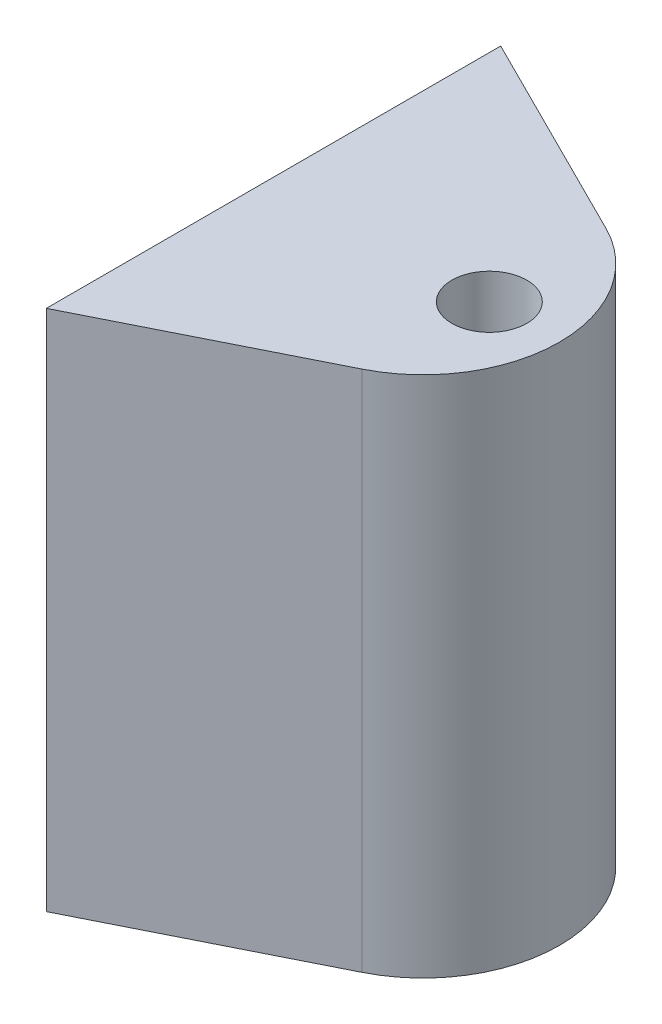
ISO-10303-21;
HEADER;
FILE_DESCRIPTION(('STEP AP214'),'2;1');
FILE_NAME('part.step','',(''),(''),'','','');
FILE_SCHEMA(('AUTOMOTIVE_DESIGN { 1 0 10303 214 1 1 1 1 }'));
ENDSEC;
DATA;
#1=APPLICATION_CONTEXT('core data for automotive mechanical design processes');
#2=APPLICATION_PROTOCOL_DEFINITION('international standard','automotive_design',2000,#1);
#3=PRODUCT_CONTEXT('',#1,'mechanical');
#4=PRODUCT('Part','Part','',(#3));
#5=PRODUCT_RELATED_PRODUCT_CATEGORY('part','',(#4));
#6=PRODUCT_DEFINITION_FORMATION('','',#4);
#7=PRODUCT_DEFINITION_CONTEXT('part definition',#1,'design');
#8=PRODUCT_DEFINITION('design','',#6,#7);
#9=PRODUCT_DEFINITION_SHAPE('','',#8);
#10=(LENGTH_UNIT() NAMED_UNIT(*) SI_UNIT(.MILLI.,.METRE.));
#11=(NAMED_UNIT(*) PLANE_ANGLE_UNIT() SI_UNIT($,.RADIAN.));
#12=(NAMED_UNIT(*) SI_UNIT($,.STERADIAN.) SOLID_ANGLE_UNIT());
#13=UNCERTAINTY_MEASURE_WITH_UNIT(LENGTH_MEASURE(1.E-05),#10,'distance_accuracy_value','');
#14=(GEOMETRIC_REPRESENTATION_CONTEXT(3) GLOBAL_UNCERTAINTY_ASSIGNED_CONTEXT((#13)) GLOBAL_UNIT_ASSIGNED_CONTEXT((#10,
#11,#12)) REPRESENTATION_CONTEXT('',''));
#15=CARTESIAN_POINT('',(0.,0.,0.));
#16=DIRECTION('',(0.,0.,1.));
#17=DIRECTION('',(1.,0.,0.));
#18=AXIS2_PLACEMENT_3D('',#15,#16,#17);
#19=CARTESIAN_POINT('',(3.70820393248878,10.0728148210461,0.));
#20=DIRECTION('',(-1.,-8.13401429544669E-13,0.));
#21=DIRECTION('',(0.,0.,1.));
#22=AXIS2_PLACEMENT_3D('',#19,#20,#21);
#23=PLANE('',#22);
#24=DIRECTION('',(0.,0.,-1.));
#25=VECTOR('',#24,1.);
#26=CARTESIAN_POINT('',(3.70820393250749,-12.9271851789539,0.));
#27=LINE('',#26,#25);
#28=CARTESIAN_POINT('',(3.70820393250749,-12.9271851789539,58.6587715524759));
#29=VERTEX_POINT('',#28);
#30=CARTESIAN_POINT('',(3.70820393250749,-12.9271851789539,38.6587715524759));
#31=VERTEX_POINT('',#30);
#32=EDGE_CURVE('E88',#29,#31,#27,.T.);
#33=ORIENTED_EDGE('',*,*,#32,.F.);
#34=DIRECTION('',(8.13401429544669E-13,-1.,0.));
#35=VECTOR('',#34,1.);
#36=CARTESIAN_POINT('',(3.70820393248878,10.0728148210461,58.6587715524759));
#37=LINE('',#36,#35);
#38=CARTESIAN_POINT('',(3.70820393248878,10.0728148210461,58.6587715524759));
#39=VERTEX_POINT('',#38);
#40=EDGE_CURVE('E83',#39,#29,#37,.T.);
#41=ORIENTED_EDGE('',*,*,#40,.F.);
#42=DIRECTION('',(0.,0.,-1.));
#43=VECTOR('',#42,1.);
#44=CARTESIAN_POINT('',(3.70820393248878,10.0728148210461,0.));
#45=LINE('',#44,#43);
#46=CARTESIAN_POINT('',(3.70820393248878,10.0728148210461,38.6587715524759));
#47=VERTEX_POINT('',#46);
#48=EDGE_CURVE('E86',#39,#47,#45,.T.);
#49=ORIENTED_EDGE('',*,*,#48,.T.);
#50=DIRECTION('',(8.13401429544669E-13,-1.,0.));
#51=VECTOR('',#50,1.);
#52=CARTESIAN_POINT('',(3.70820393248878,10.0728148210461,38.6587715524759));
#53=LINE('',#52,#51);
#54=EDGE_CURVE('E91',#47,#31,#53,.T.);
#55=ORIENTED_EDGE('',*,*,#54,.T.);
#56=EDGE_LOOP('',(#33,#41,#49,#55));
#57=FACE_BOUND('',#56,.T.);
#58=ADVANCED_FACE('F41',(#57),#23,.T.);
#59=CARTESIAN_POINT('',(29.8634012643207,10.0728148210674,45.5811728865599));
#60=DIRECTION('',(-0.447213595499958,-3.63764177891477E-13,-0.894427190999916));
#61=DIRECTION('',(-0.894427190999916,-7.27528355782954E-13,0.447213595499958));
#62=AXIS2_PLACEMENT_3D('',#59,#60,#61);
#63=PLANE('',#62);
#64=DIRECTION('',(0.894427190999916,7.27528355782954E-13,-0.447213595499958));
#65=VECTOR('',#64,1.);
#66=CARTESIAN_POINT('',(29.8634012643394,-12.9271851789326,45.5811728865599));
#67=LINE('',#66,#65);
#68=CARTESIAN_POINT('',(12.9750776405085,-12.9271851789463,54.0253346984754));
#69=VERTEX_POINT('',#68);
#70=EDGE_CURVE('E107',#29,#69,#67,.T.);
#71=ORIENTED_EDGE('',*,*,#70,.T.);
#72=DIRECTION('',(8.13401429544669E-13,-1.,0.));
#73=VECTOR('',#72,1.);
#74=CARTESIAN_POINT('',(12.9750776404898,10.0728148210537,54.0253346984754));
#75=LINE('',#74,#73);
#76=CARTESIAN_POINT('',(12.9750776404898,10.0728148210537,54.0253346984754));
#77=VERTEX_POINT('',#76);
#78=EDGE_CURVE('E50',#69,#77,#75,.F.);
#79=ORIENTED_EDGE('',*,*,#78,.T.);
#80=DIRECTION('',(0.894427190999916,7.27528355782954E-13,-0.447213595499958));
#81=VECTOR('',#80,1.);
#82=CARTESIAN_POINT('',(29.8634012643207,10.0728148210674,45.5811728865599));
#83=LINE('',#82,#81);
#84=EDGE_CURVE('E93',#39,#77,#83,.T.);
#85=ORIENTED_EDGE('',*,*,#84,.F.);
#86=ORIENTED_EDGE('',*,*,#40,.T.);
#87=EDGE_LOOP('',(#71,#79,#85,#86));
#88=FACE_BOUND('',#87,.T.);
#89=ADVANCED_FACE('F94',(#88),#63,.F.);
#90=CARTESIAN_POINT('',(-9.06361597766002,10.0728148210358,32.2728615974015));
#91=DIRECTION('',(-0.447213595499958,-3.63764177891477E-13,0.894427190999916));
#92=DIRECTION('',(0.894427190999916,7.27528355782954E-13,0.447213595499958));
#93=AXIS2_PLACEMENT_3D('',#90,#91,#92);
#94=PLANE('',#93);
#95=DIRECTION('',(-0.894427190999916,-7.27528355782954E-13,-0.447213595499958));
#96=VECTOR('',#95,1.);
#97=CARTESIAN_POINT('',(-9.06361597766002,10.0728148210358,32.2728615974015));
#98=LINE('',#97,#96);
#99=CARTESIAN_POINT('',(12.9750776404898,10.0728148210537,43.2922084064764));
#100=VERTEX_POINT('',#99);
#101=EDGE_CURVE('E98',#100,#47,#98,.T.);
#102=ORIENTED_EDGE('',*,*,#101,.F.);
#103=DIRECTION('',(8.13401429544669E-13,-1.,0.));
#104=VECTOR('',#103,1.);
#105=CARTESIAN_POINT('',(12.9750776404898,10.0728148210537,43.2922084064764));
#106=LINE('',#105,#104);
#107=CARTESIAN_POINT('',(12.9750776405085,-12.9271851789463,43.2922084064764));
#108=VERTEX_POINT('',#107);
#109=EDGE_CURVE('E90',#100,#108,#106,.T.);
#110=ORIENTED_EDGE('',*,*,#109,.T.);
#111=DIRECTION('',(-0.894427190999916,-7.27528355782954E-13,-0.447213595499958));
#112=VECTOR('',#111,1.);
#113=CARTESIAN_POINT('',(-9.06361597764131,-12.9271851789642,32.2728615974015));
#114=LINE('',#113,#112);
#115=EDGE_CURVE('E104',#108,#31,#114,.T.);
#116=ORIENTED_EDGE('',*,*,#115,.T.);
#117=ORIENTED_EDGE('',*,*,#54,.F.);
#118=EDGE_LOOP('',(#102,#110,#116,#117));
#119=FACE_BOUND('',#118,.T.);
#120=ADVANCED_FACE('F128',(#119),#94,.F.);
#121=CARTESIAN_POINT('',(7.07281482104072,10.0728148210489,0.));
#122=DIRECTION('',(-8.13401429544669E-13,1.,0.));
#123=DIRECTION('',(0.,0.,-1.));
#124=AXIS2_PLACEMENT_3D('',#121,#122,#123);
#125=PLANE('',#124);
#126=CARTESIAN_POINT('',(13.2082039324888,10.0728148210539,48.6587715524759));
#127=DIRECTION('',(8.13401429544669E-13,-1.,0.));
#128=DIRECTION('',(0.,0.,1.));
#129=AXIS2_PLACEMENT_3D('',#126,#127,#128);
#130=CIRCLE('',#129,1.64999999999999);
#131=CARTESIAN_POINT('',(13.2082039324888,10.0728148210539,50.3087715524759));
#132=VERTEX_POINT('',#131);
#133=EDGE_CURVE('E110',#132,#132,#130,.T.);
#134=ORIENTED_EDGE('',*,*,#133,.T.);
#135=EDGE_LOOP('',(#134));
#136=FACE_BOUND('',#135,.T.);
#137=ORIENTED_EDGE('',*,*,#84,.T.);
#138=CARTESIAN_POINT('',(10.29179606749,10.0728148210515,48.6587715524759));
#139=DIRECTION('',(-8.13401429544669E-13,1.,0.));
#140=DIRECTION('',(0.,0.,-1.));
#141=AXIS2_PLACEMENT_3D('',#138,#139,#140);
#142=CIRCLE('',#141,6.);
#143=EDGE_CURVE('E11',#77,#100,#142,.T.);
#144=ORIENTED_EDGE('',*,*,#143,.T.);
#145=ORIENTED_EDGE('',*,*,#101,.T.);
#146=ORIENTED_EDGE('',*,*,#48,.F.);
#147=EDGE_LOOP('',(#137,#144,#145,#146));
#148=FACE_BOUND('',#147,.T.);
#149=ADVANCED_FACE('F100',(#136,#148),#125,.T.);
#150=CARTESIAN_POINT('',(7.07281482105942,-12.9271851789511,0.));
#151=DIRECTION('',(-8.13401429544669E-13,1.,0.));
#152=DIRECTION('',(0.,0.,-1.));
#153=AXIS2_PLACEMENT_3D('',#150,#151,#152);
#154=PLANE('',#153);
#155=CARTESIAN_POINT('',(13.2082039325075,-12.9271851789461,48.6587715524759));
#156=DIRECTION('',(8.13401429544669E-13,-1.,0.));
#157=DIRECTION('',(0.,0.,1.));
#158=AXIS2_PLACEMENT_3D('',#155,#156,#157);
#159=CIRCLE('',#158,1.65);
#160=CARTESIAN_POINT('',(13.2082039325075,-12.9271851789461,50.3087715524759));
#161=VERTEX_POINT('',#160);
#162=EDGE_CURVE('E156',#161,#161,#159,.T.);
#163=ORIENTED_EDGE('',*,*,#162,.F.);
#164=EDGE_LOOP('',(#163));
#165=FACE_BOUND('',#164,.T.);
#166=ORIENTED_EDGE('',*,*,#115,.F.);
#167=CARTESIAN_POINT('',(10.2917960675088,-12.9271851789485,48.6587715524759));
#168=DIRECTION('',(-8.13401429544669E-13,1.,0.));
#169=DIRECTION('',(0.,0.,-1.));
#170=AXIS2_PLACEMENT_3D('',#167,#168,#169);
#171=CIRCLE('',#170,6.);
#172=EDGE_CURVE('E64',#108,#69,#171,.F.);
#173=ORIENTED_EDGE('',*,*,#172,.T.);
#174=ORIENTED_EDGE('',*,*,#70,.F.);
#175=ORIENTED_EDGE('',*,*,#32,.T.);
#176=EDGE_LOOP('',(#166,#173,#174,#175));
#177=FACE_BOUND('',#176,.T.);
#178=ADVANCED_FACE('F130',(#165,#177),#154,.F.);
#179=CARTESIAN_POINT('',(10.29179606749,10.0728148210515,48.6587715524759));
#180=DIRECTION('',(8.13401429544669E-13,-1.,0.));
#181=DIRECTION('',(0.,0.,1.));
#182=AXIS2_PLACEMENT_3D('',#179,#180,#181);
#183=CYLINDRICAL_SURFACE('',#182,6.);
#184=ORIENTED_EDGE('',*,*,#143,.F.);
#185=ORIENTED_EDGE('',*,*,#78,.F.);
#186=ORIENTED_EDGE('',*,*,#172,.F.);
#187=ORIENTED_EDGE('',*,*,#109,.F.);
#188=EDGE_LOOP('',(#184,#185,#186,#187));
#189=FACE_BOUND('',#188,.T.);
#190=ADVANCED_FACE('F43',(#189),#183,.T.);
#191=CARTESIAN_POINT('',(13.2082039325075,-12.9271851789461,48.6587715524759));
#192=DIRECTION('',(8.13401429544669E-13,-1.,0.));
#193=DIRECTION('',(0.,0.,1.));
#194=AXIS2_PLACEMENT_3D('',#191,#192,#193);
#195=CYLINDRICAL_SURFACE('',#194,1.65);
#196=ORIENTED_EDGE('',*,*,#133,.F.);
#197=EDGE_LOOP('',(#196));
#198=FACE_BOUND('',#197,.T.);
#199=ORIENTED_EDGE('',*,*,#162,.T.);
#200=EDGE_LOOP('',(#199));
#201=FACE_BOUND('',#200,.T.);
#202=ADVANCED_FACE('F132',(#198,#201),#195,.F.);
#203=CLOSED_SHELL('',(#58,#89,#120,#149,#178,#190,#202));
#204=MANIFOLD_SOLID_BREP('B2',#203);
#205=ADVANCED_BREP_SHAPE_REPRESENTATION('',(#18,#204),#14);
#206=SHAPE_DEFINITION_REPRESENTATION(#9,#205);
ENDSEC;
END-ISO-10303-21;
